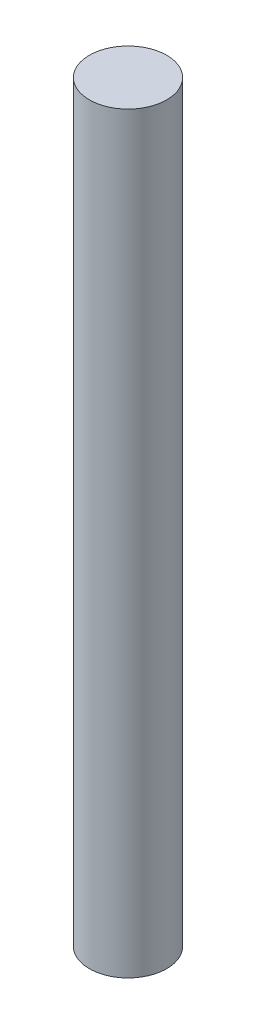
ISO-10303-21;
HEADER;
FILE_DESCRIPTION(('STEP AP214'),'2;1');
FILE_NAME('part.step','',(''),(''),'','','');
FILE_SCHEMA(('AUTOMOTIVE_DESIGN { 1 0 10303 214 1 1 1 1 }'));
ENDSEC;
DATA;
#1=APPLICATION_CONTEXT('core data for automotive mechanical design processes');
#2=APPLICATION_PROTOCOL_DEFINITION('international standard','automotive_design',2000,#1);
#3=PRODUCT_CONTEXT('',#1,'mechanical');
#4=PRODUCT('Part','Part','',(#3));
#5=PRODUCT_RELATED_PRODUCT_CATEGORY('part','',(#4));
#6=PRODUCT_DEFINITION_FORMATION('','',#4);
#7=PRODUCT_DEFINITION_CONTEXT('part definition',#1,'design');
#8=PRODUCT_DEFINITION('design','',#6,#7);
#9=PRODUCT_DEFINITION_SHAPE('','',#8);
#10=(LENGTH_UNIT() NAMED_UNIT(*) SI_UNIT(.MILLI.,.METRE.));
#11=(NAMED_UNIT(*) PLANE_ANGLE_UNIT() SI_UNIT($,.RADIAN.));
#12=(NAMED_UNIT(*) SI_UNIT($,.STERADIAN.) SOLID_ANGLE_UNIT());
#13=UNCERTAINTY_MEASURE_WITH_UNIT(LENGTH_MEASURE(1.E-05),#10,'distance_accuracy_value','');
#14=(GEOMETRIC_REPRESENTATION_CONTEXT(3) GLOBAL_UNCERTAINTY_ASSIGNED_CONTEXT((#13)) GLOBAL_UNIT_ASSIGNED_CONTEXT((#10,
#11,#12)) REPRESENTATION_CONTEXT('',''));
#15=CARTESIAN_POINT('',(0.,0.,0.));
#16=DIRECTION('',(0.,0.,1.));
#17=DIRECTION('',(1.,0.,0.));
#18=AXIS2_PLACEMENT_3D('',#15,#16,#17);
#19=CARTESIAN_POINT('',(0.,30.8,0.));
#20=DIRECTION('',(0.,-1.,0.));
#21=DIRECTION('',(0.,0.,-1.));
#22=AXIS2_PLACEMENT_3D('',#19,#20,#21);
#23=CYLINDRICAL_SURFACE('',#22,1.5825);
#24=CARTESIAN_POINT('',(0.,30.8,0.));
#25=DIRECTION('',(0.,1.,0.));
#26=DIRECTION('',(0.,0.,1.));
#27=AXIS2_PLACEMENT_3D('',#24,#25,#26);
#28=CIRCLE('',#27,1.5825);
#29=CARTESIAN_POINT('',(0.,30.8,-1.5825));
#30=VERTEX_POINT('',#29);
#31=EDGE_CURVE('E10',#30,#30,#28,.T.);
#32=CARTESIAN_POINT('',(0.,0.,0.));
#33=DIRECTION('',(0.,1.,0.));
#34=DIRECTION('',(0.,0.,1.));
#35=AXIS2_PLACEMENT_3D('',#32,#33,#34);
#36=CIRCLE('',#35,1.5825);
#37=CARTESIAN_POINT('',(0.,0.,-1.5825));
#38=VERTEX_POINT('',#37);
#39=EDGE_CURVE('E34',#38,#38,#36,.T.);
#40=CARTESIAN_POINT('',(0.,30.8,-1.5825));
#41=CARTESIAN_POINT('',(0.,30.4791666666667,-1.5825));
#42=CARTESIAN_POINT('',(0.,30.1583333333333,-1.5825));
#43=CARTESIAN_POINT('',(0.,29.5166666666667,-1.5825));
#44=CARTESIAN_POINT('',(0.,29.1958333333333,-1.5825));
#45=CARTESIAN_POINT('',(0.,28.5541666666667,-1.5825));
#46=CARTESIAN_POINT('',(0.,28.2333333333333,-1.5825));
#47=CARTESIAN_POINT('',(0.,27.5916666666667,-1.5825));
#48=CARTESIAN_POINT('',(0.,27.2708333333333,-1.5825));
#49=CARTESIAN_POINT('',(0.,26.6291666666667,-1.5825));
#50=CARTESIAN_POINT('',(0.,26.3083333333333,-1.5825));
#51=CARTESIAN_POINT('',(0.,25.6666666666667,-1.5825));
#52=CARTESIAN_POINT('',(0.,25.3458333333333,-1.5825));
#53=CARTESIAN_POINT('',(0.,24.7041666666667,-1.5825));
#54=CARTESIAN_POINT('',(0.,24.3833333333333,-1.5825));
#55=CARTESIAN_POINT('',(0.,23.7416666666667,-1.5825));
#56=CARTESIAN_POINT('',(0.,23.4208333333333,-1.5825));
#57=CARTESIAN_POINT('',(0.,22.7791666666667,-1.5825));
#58=CARTESIAN_POINT('',(0.,22.4583333333333,-1.5825));
#59=CARTESIAN_POINT('',(0.,21.8166666666667,-1.5825));
#60=CARTESIAN_POINT('',(0.,21.4958333333333,-1.5825));
#61=CARTESIAN_POINT('',(0.,20.8541666666667,-1.5825));
#62=CARTESIAN_POINT('',(0.,20.5333333333333,-1.5825));
#63=CARTESIAN_POINT('',(0.,19.8916666666667,-1.5825));
#64=CARTESIAN_POINT('',(0.,19.5708333333333,-1.5825));
#65=CARTESIAN_POINT('',(0.,18.9291666666667,-1.5825));
#66=CARTESIAN_POINT('',(0.,18.6083333333333,-1.5825));
#67=CARTESIAN_POINT('',(0.,17.9666666666667,-1.5825));
#68=CARTESIAN_POINT('',(0.,17.6458333333333,-1.5825));
#69=CARTESIAN_POINT('',(0.,17.0041666666667,-1.5825));
#70=CARTESIAN_POINT('',(0.,16.6833333333333,-1.5825));
#71=CARTESIAN_POINT('',(0.,16.0416666666667,-1.5825));
#72=CARTESIAN_POINT('',(0.,15.7208333333333,-1.5825));
#73=CARTESIAN_POINT('',(0.,15.0791666666667,-1.5825));
#74=CARTESIAN_POINT('',(0.,14.7583333333333,-1.5825));
#75=CARTESIAN_POINT('',(0.,14.1166666666667,-1.5825));
#76=CARTESIAN_POINT('',(0.,13.7958333333333,-1.5825));
#77=CARTESIAN_POINT('',(0.,13.1541666666667,-1.5825));
#78=CARTESIAN_POINT('',(0.,12.8333333333333,-1.5825));
#79=CARTESIAN_POINT('',(0.,12.1916666666667,-1.5825));
#80=CARTESIAN_POINT('',(0.,11.8708333333333,-1.5825));
#81=CARTESIAN_POINT('',(0.,11.2291666666667,-1.5825));
#82=CARTESIAN_POINT('',(0.,10.9083333333333,-1.5825));
#83=CARTESIAN_POINT('',(0.,10.2666666666667,-1.5825));
#84=CARTESIAN_POINT('',(0.,9.94583333333333,-1.5825));
#85=CARTESIAN_POINT('',(0.,9.30416666666666,-1.5825));
#86=CARTESIAN_POINT('',(0.,8.98333333333333,-1.5825));
#87=CARTESIAN_POINT('',(0.,8.34166666666666,-1.5825));
#88=CARTESIAN_POINT('',(0.,8.02083333333333,-1.5825));
#89=CARTESIAN_POINT('',(0.,7.37916666666666,-1.5825));
#90=CARTESIAN_POINT('',(0.,7.05833333333333,-1.5825));
#91=CARTESIAN_POINT('',(0.,6.41666666666666,-1.5825));
#92=CARTESIAN_POINT('',(0.,6.09583333333333,-1.5825));
#93=CARTESIAN_POINT('',(0.,5.45416666666667,-1.5825));
#94=CARTESIAN_POINT('',(0.,5.13333333333333,-1.5825));
#95=CARTESIAN_POINT('',(0.,4.49166666666666,-1.5825));
#96=CARTESIAN_POINT('',(0.,4.17083333333333,-1.5825));
#97=CARTESIAN_POINT('',(0.,3.52916666666666,-1.5825));
#98=CARTESIAN_POINT('',(0.,3.20833333333333,-1.5825));
#99=CARTESIAN_POINT('',(0.,2.56666666666666,-1.5825));
#100=CARTESIAN_POINT('',(0.,2.24583333333333,-1.5825));
#101=CARTESIAN_POINT('',(0.,1.60416666666666,-1.5825));
#102=CARTESIAN_POINT('',(0.,1.28333333333333,-1.5825));
#103=CARTESIAN_POINT('',(0.,0.641666666666664,-1.5825));
#104=CARTESIAN_POINT('',(0.,0.32083333333333,-1.5825));
#105=CARTESIAN_POINT('',(0.,0.,-1.5825));
#106=B_SPLINE_CURVE_WITH_KNOTS('',3,(#40,#41,#42,#43,#44,#45,#46,#47,#48,#49,#50,#51,#52,#53,
#54,#55,#56,#57,#58,#59,#60,#61,#62,#63,#64,#65,#66,#67,#68,#69,#70,#71,#72,#73,#74,#75,#76,#77,
#78,#79,#80,#81,#82,#83,#84,#85,#86,#87,#88,#89,#90,#91,#92,#93,#94,#95,#96,#97,#98,#99,#100,
#101,#102,#103,#104,#105),.UNSPECIFIED.,.F.,.F.,(4,2,2,2,2,2,2,2,2,2,2,2,2,2,2,2,2,2,2,2,2,2,2,
2,2,2,2,2,2,2,2,2,4),(0.,0.962499999999998,1.925,2.8875,3.85,4.8125,5.775,6.7375,7.7,8.6625,
9.625,10.5875,11.55,12.5125,13.475,14.4375,15.4,16.3625,17.325,18.2875,19.25,20.2125,21.175,
22.1375,23.1,24.0625,25.025,25.9875,26.95,27.9125,28.875,29.8375,30.8),.UNSPECIFIED.);
#107=EDGE_CURVE('BSEAM31',#30,#38,#106,.T.);
#108=ORIENTED_EDGE('',*,*,#31,.F.);
#109=ORIENTED_EDGE('',*,*,#39,.T.);
#110=ORIENTED_EDGE('',*,*,#107,.T.);
#111=ORIENTED_EDGE('',*,*,#107,.F.);
#112=EDGE_LOOP('',(#108,#110,#109,#111));
#113=FACE_BOUND('',#112,.T.);
#114=ADVANCED_FACE('F31',(#113),#23,.T.);
#115=CARTESIAN_POINT('',(0.,30.8,0.));
#116=DIRECTION('',(0.,1.,0.));
#117=DIRECTION('',(0.,0.,1.));
#118=AXIS2_PLACEMENT_3D('',#115,#116,#117);
#119=PLANE('',#118);
#120=ORIENTED_EDGE('',*,*,#31,.T.);
#121=EDGE_LOOP('',(#120));
#122=FACE_BOUND('',#121,.T.);
#123=ADVANCED_FACE('F46',(#122),#119,.T.);
#124=CARTESIAN_POINT('',(0.,0.,0.));
#125=DIRECTION('',(0.,1.,0.));
#126=DIRECTION('',(0.,0.,1.));
#127=AXIS2_PLACEMENT_3D('',#124,#125,#126);
#128=PLANE('',#127);
#129=ORIENTED_EDGE('',*,*,#39,.F.);
#130=EDGE_LOOP('',(#129));
#131=FACE_BOUND('',#130,.T.);
#132=ADVANCED_FACE('F44',(#131),#128,.F.);
#133=CLOSED_SHELL('',(#114,#123,#132));
#134=MANIFOLD_SOLID_BREP('B2',#133);
#135=ADVANCED_BREP_SHAPE_REPRESENTATION('',(#18,#134),#14);
#136=SHAPE_DEFINITION_REPRESENTATION(#9,#135);
ENDSEC;
END-ISO-10303-21;
